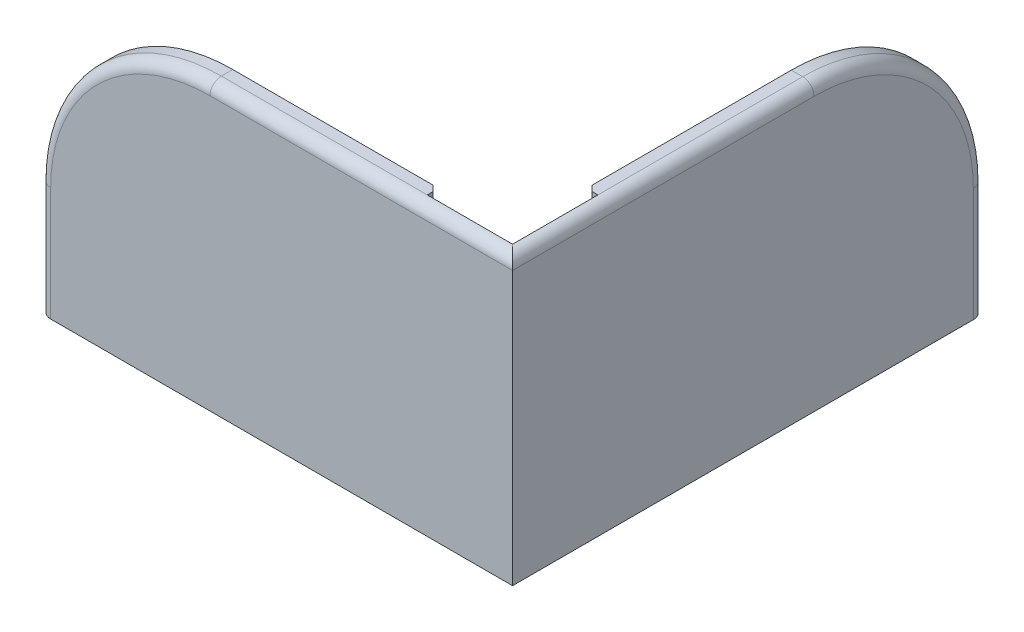
ISO-10303-21;
HEADER;
FILE_DESCRIPTION(('STEP AP214'),'2;1');
FILE_NAME('part.step','',(''),(''),'','','');
FILE_SCHEMA(('AUTOMOTIVE_DESIGN { 1 0 10303 214 1 1 1 1 }'));
ENDSEC;
DATA;
#1=APPLICATION_CONTEXT('core data for automotive mechanical design processes');
#2=APPLICATION_PROTOCOL_DEFINITION('international standard','automotive_design',2000,#1);
#3=PRODUCT_CONTEXT('',#1,'mechanical');
#4=PRODUCT('Part','Part','',(#3));
#5=PRODUCT_RELATED_PRODUCT_CATEGORY('part','',(#4));
#6=PRODUCT_DEFINITION_FORMATION('','',#4);
#7=PRODUCT_DEFINITION_CONTEXT('part definition',#1,'design');
#8=PRODUCT_DEFINITION('design','',#6,#7);
#9=PRODUCT_DEFINITION_SHAPE('','',#8);
#10=(LENGTH_UNIT() NAMED_UNIT(*) SI_UNIT(.MILLI.,.METRE.));
#11=(NAMED_UNIT(*) PLANE_ANGLE_UNIT() SI_UNIT($,.RADIAN.));
#12=(NAMED_UNIT(*) SI_UNIT($,.STERADIAN.) SOLID_ANGLE_UNIT());
#13=UNCERTAINTY_MEASURE_WITH_UNIT(LENGTH_MEASURE(1.E-05),#10,'distance_accuracy_value','');
#14=(GEOMETRIC_REPRESENTATION_CONTEXT(3) GLOBAL_UNCERTAINTY_ASSIGNED_CONTEXT((#13)) GLOBAL_UNIT_ASSIGNED_CONTEXT((#10,
#11,#12)) REPRESENTATION_CONTEXT('',''));
#15=CARTESIAN_POINT('',(0.,0.,0.));
#16=DIRECTION('',(0.,0.,1.));
#17=DIRECTION('',(1.,0.,0.));
#18=AXIS2_PLACEMENT_3D('',#15,#16,#17);
#19=CARTESIAN_POINT('',(0.,63.5,-1.27));
#20=DIRECTION('',(0.,1.,0.));
#21=DIRECTION('',(-1.,0.,0.));
#22=AXIS2_PLACEMENT_3D('',#19,#20,#21);
#23=PLANE('',#22);
#24=DIRECTION('',(0.,0.,1.));
#25=VECTOR('',#24,1.);
#26=CARTESIAN_POINT('',(-17.526,63.5,-1.27));
#27=LINE('',#26,#25);
#28=CARTESIAN_POINT('',(-17.526,63.5,0.));
#29=VERTEX_POINT('',#28);
#30=CARTESIAN_POINT('',(-17.526,63.5,1.27));
#31=VERTEX_POINT('',#30);
#32=EDGE_CURVE('E238',#29,#31,#27,.T.);
#33=ORIENTED_EDGE('',*,*,#32,.F.);
#34=DIRECTION('',(-0.707106781186551,0.,-0.707106781186544));
#35=VECTOR('',#34,1.);
#36=CARTESIAN_POINT('',(-9.3979999999999,63.5,8.12799999999999));
#37=LINE('',#36,#35);
#38=CARTESIAN_POINT('',(-18.796,63.5,-1.27));
#39=VERTEX_POINT('',#38);
#40=EDGE_CURVE('E378',#29,#39,#37,.T.);
#41=ORIENTED_EDGE('',*,*,#40,.T.);
#42=DIRECTION('',(-1.,0.,0.));
#43=VECTOR('',#42,1.);
#44=CARTESIAN_POINT('',(0.,63.5,-1.27));
#45=LINE('',#44,#43);
#46=CARTESIAN_POINT('',(-63.5,63.5,-1.27));
#47=VERTEX_POINT('',#46);
#48=EDGE_CURVE('E328',#39,#47,#45,.T.);
#49=ORIENTED_EDGE('',*,*,#48,.T.);
#50=DIRECTION('',(0.,0.,1.));
#51=VECTOR('',#50,1.);
#52=CARTESIAN_POINT('',(-63.5,63.5,-1.27));
#53=LINE('',#52,#51);
#54=CARTESIAN_POINT('',(-63.5,63.5,1.27));
#55=VERTEX_POINT('',#54);
#56=EDGE_CURVE('E298',#47,#55,#53,.T.);
#57=ORIENTED_EDGE('',*,*,#56,.T.);
#58=DIRECTION('',(-1.,0.,0.));
#59=VECTOR('',#58,1.);
#60=CARTESIAN_POINT('',(0.,63.5,1.27));
#61=LINE('',#60,#59);
#62=EDGE_CURVE('E244',#55,#31,#61,.F.);
#63=ORIENTED_EDGE('',*,*,#62,.T.);
#64=EDGE_LOOP('',(#33,#41,#49,#57,#63));
#65=FACE_BOUND('',#64,.T.);
#66=ADVANCED_FACE('F35',(#65),#23,.T.);
#67=CARTESIAN_POINT('',(0.253999999999998,25.4,-63.5));
#68=DIRECTION('',(-1.,0.,0.));
#69=DIRECTION('',(0.,0.,1.));
#70=AXIS2_PLACEMENT_3D('',#67,#68,#69);
#71=PLANE('',#70);
#72=DIRECTION('',(0.,1.,0.));
#73=VECTOR('',#72,1.);
#74=CARTESIAN_POINT('',(0.253999999999998,0.,0.));
#75=LINE('',#74,#73);
#76=CARTESIAN_POINT('',(0.253999999999998,0.,0.));
#77=VERTEX_POINT('',#76);
#78=CARTESIAN_POINT('',(0.253999999999998,11.43,0.));
#79=VERTEX_POINT('',#78);
#80=EDGE_CURVE('E212',#77,#79,#75,.T.);
#81=ORIENTED_EDGE('',*,*,#80,.T.);
#82=DIRECTION('',(0.,0.,-1.));
#83=VECTOR('',#82,1.);
#84=CARTESIAN_POINT('',(0.253999999999998,11.43,-17.78));
#85=LINE('',#84,#83);
#86=CARTESIAN_POINT('',(0.253999999999998,11.43,-17.78));
#87=VERTEX_POINT('',#86);
#88=EDGE_CURVE('E267',#79,#87,#85,.T.);
#89=ORIENTED_EDGE('',*,*,#88,.T.);
#90=DIRECTION('',(0.,1.,0.));
#91=VECTOR('',#90,1.);
#92=CARTESIAN_POINT('',(0.253999999999998,12.7,-17.78));
#93=LINE('',#92,#91);
#94=CARTESIAN_POINT('',(0.253999999999998,25.4,-17.78));
#95=VERTEX_POINT('',#94);
#96=EDGE_CURVE('E200',#87,#95,#93,.T.);
#97=ORIENTED_EDGE('',*,*,#96,.T.);
#98=DIRECTION('',(0.,0.,1.));
#99=VECTOR('',#98,1.);
#100=CARTESIAN_POINT('',(0.253999999999998,25.4,-17.78));
#101=LINE('',#100,#99);
#102=CARTESIAN_POINT('',(0.253999999999998,25.4,-101.6));
#103=VERTEX_POINT('',#102);
#104=EDGE_CURVE('E182',#103,#95,#101,.T.);
#105=ORIENTED_EDGE('',*,*,#104,.F.);
#106=DIRECTION('',(0.,-1.,0.));
#107=VECTOR('',#106,1.);
#108=CARTESIAN_POINT('',(0.253999999999998,0.,-101.6));
#109=LINE('',#108,#107);
#110=CARTESIAN_POINT('',(0.253999999999998,0.,-101.6));
#111=VERTEX_POINT('',#110);
#112=EDGE_CURVE('E207',#103,#111,#109,.T.);
#113=ORIENTED_EDGE('',*,*,#112,.T.);
#114=DIRECTION('',(0.,0.,1.));
#115=VECTOR('',#114,1.);
#116=CARTESIAN_POINT('',(0.253999999999998,0.,0.));
#117=LINE('',#116,#115);
#118=EDGE_CURVE('E210',#111,#77,#117,.T.);
#119=ORIENTED_EDGE('',*,*,#118,.T.);
#120=EDGE_LOOP('',(#81,#89,#97,#105,#113,#119));
#121=FACE_BOUND('',#120,.T.);
#122=ADVANCED_FACE('F398',(#121),#71,.T.);
#123=CARTESIAN_POINT('',(1.524,25.4,-63.5));
#124=DIRECTION('',(1.,0.,0.));
#125=DIRECTION('',(0.,0.,-1.));
#126=AXIS2_PLACEMENT_3D('',#123,#124,#125);
#127=PLANE('',#126);
#128=DIRECTION('',(0.,1.,0.));
#129=VECTOR('',#128,1.);
#130=CARTESIAN_POINT('',(1.524,12.7,-17.78));
#131=LINE('',#130,#129);
#132=CARTESIAN_POINT('',(1.524,12.7,-17.78));
#133=VERTEX_POINT('',#132);
#134=CARTESIAN_POINT('',(1.524,63.5,-17.78));
#135=VERTEX_POINT('',#134);
#136=EDGE_CURVE('E197',#133,#135,#131,.T.);
#137=ORIENTED_EDGE('',*,*,#136,.F.);
#138=DIRECTION('',(0.,0.,-1.));
#139=VECTOR('',#138,1.);
#140=CARTESIAN_POINT('',(1.524,12.7,1.27));
#141=LINE('',#140,#139);
#142=CARTESIAN_POINT('',(1.524,12.7,1.27));
#143=VERTEX_POINT('',#142);
#144=EDGE_CURVE('E306',#143,#133,#141,.T.);
#145=ORIENTED_EDGE('',*,*,#144,.F.);
#146=DIRECTION('',(0.,1.,0.));
#147=VECTOR('',#146,1.);
#148=CARTESIAN_POINT('',(1.524,0.,1.27));
#149=LINE('',#148,#147);
#150=CARTESIAN_POINT('',(1.524,63.5,1.27));
#151=VERTEX_POINT('',#150);
#152=EDGE_CURVE('E601',#143,#151,#149,.T.);
#153=ORIENTED_EDGE('',*,*,#152,.T.);
#154=DIRECTION('',(0.,0.,1.));
#155=VECTOR('',#154,1.);
#156=CARTESIAN_POINT('',(1.524,63.5,3.81));
#157=LINE('',#156,#155);
#158=EDGE_CURVE('E217',#135,#151,#157,.T.);
#159=ORIENTED_EDGE('',*,*,#158,.F.);
#160=EDGE_LOOP('',(#137,#145,#153,#159));
#161=FACE_BOUND('',#160,.T.);
#162=ADVANCED_FACE('F403',(#161),#127,.F.);
#163=DIRECTION('',(0.,0.,-1.));
#164=VECTOR('',#163,1.);
#165=CARTESIAN_POINT('',(-1.016,63.5,-17.78));
#166=LINE('',#165,#164);
#167=CARTESIAN_POINT('',(-1.016,63.5,-19.05));
#168=VERTEX_POINT('',#167);
#169=CARTESIAN_POINT('',(-1.016,63.5,-63.5));
#170=VERTEX_POINT('',#169);
#171=EDGE_CURVE('E175',#168,#170,#166,.T.);
#172=ORIENTED_EDGE('',*,*,#171,.F.);
#173=DIRECTION('',(0.707106781186543,0.,0.707106781186552));
#174=VECTOR('',#173,1.);
#175=CARTESIAN_POINT('',(8.38199999999999,63.5,-9.6519999999999));
#176=LINE('',#175,#174);
#177=CARTESIAN_POINT('',(0.253999999999991,63.5,-17.78));
#178=VERTEX_POINT('',#177);
#179=EDGE_CURVE('E52',#168,#178,#176,.T.);
#180=ORIENTED_EDGE('',*,*,#179,.T.);
#181=DIRECTION('',(1.,0.,0.));
#182=VECTOR('',#181,1.);
#183=CARTESIAN_POINT('',(0.253999999999998,63.5,-17.78));
#184=LINE('',#183,#182);
#185=EDGE_CURVE('E214',#178,#135,#184,.T.);
#186=ORIENTED_EDGE('',*,*,#185,.T.);
#187=DIRECTION('',(0.,0.,1.));
#188=VECTOR('',#187,1.);
#189=CARTESIAN_POINT('',(1.524,63.5,-1.27));
#190=LINE('',#189,#188);
#191=CARTESIAN_POINT('',(1.524,63.5,-63.5));
#192=VERTEX_POINT('',#191);
#193=EDGE_CURVE('E188',#135,#192,#190,.F.);
#194=ORIENTED_EDGE('',*,*,#193,.T.);
#195=DIRECTION('',(-1.,0.,0.));
#196=VECTOR('',#195,1.);
#197=CARTESIAN_POINT('',(4.064,63.5,-63.5));
#198=LINE('',#197,#196);
#199=EDGE_CURVE('E185',#192,#170,#198,.T.);
#200=ORIENTED_EDGE('',*,*,#199,.T.);
#201=EDGE_LOOP('',(#172,#180,#186,#194,#200));
#202=FACE_BOUND('',#201,.T.);
#203=ADVANCED_FACE('F186',(#202),#23,.T.);
#204=CARTESIAN_POINT('',(-17.526,0.,-1.27));
#205=DIRECTION('',(1.,0.,0.));
#206=DIRECTION('',(0.,0.,-1.));
#207=AXIS2_PLACEMENT_3D('',#204,#205,#206);
#208=PLANE('',#207);
#209=DIRECTION('',(0.,1.,0.));
#210=VECTOR('',#209,1.);
#211=CARTESIAN_POINT('',(-17.526,0.,0.));
#212=LINE('',#211,#210);
#213=CARTESIAN_POINT('',(-17.526,11.4299999999999,0.));
#214=VERTEX_POINT('',#213);
#215=CARTESIAN_POINT('',(-17.526,25.4,0.));
#216=VERTEX_POINT('',#215);
#217=EDGE_CURVE('E233',#214,#216,#212,.T.);
#218=ORIENTED_EDGE('',*,*,#217,.T.);
#219=DIRECTION('',(0.,1.,0.));
#220=VECTOR('',#219,1.);
#221=CARTESIAN_POINT('',(-17.526,63.5,0.));
#222=LINE('',#221,#220);
#223=EDGE_CURVE('E295',#216,#29,#222,.T.);
#224=ORIENTED_EDGE('',*,*,#223,.T.);
#225=ORIENTED_EDGE('',*,*,#32,.T.);
#226=DIRECTION('',(0.,1.,0.));
#227=VECTOR('',#226,1.);
#228=CARTESIAN_POINT('',(-17.526,0.,1.27));
#229=LINE('',#228,#227);
#230=CARTESIAN_POINT('',(-17.526,12.6999999999999,1.27));
#231=VERTEX_POINT('',#230);
#232=EDGE_CURVE('E303',#231,#31,#229,.T.);
#233=ORIENTED_EDGE('',*,*,#232,.F.);
#234=DIRECTION('',(0.,0.707106781186551,0.707106781186544));
#235=VECTOR('',#234,1.);
#236=CARTESIAN_POINT('',(-17.526,12.7,1.27000000000004));
#237=LINE('',#236,#235);
#238=EDGE_CURVE('E11',#231,#214,#237,.F.);
#239=ORIENTED_EDGE('',*,*,#238,.T.);
#240=EDGE_LOOP('',(#218,#224,#225,#233,#239));
#241=FACE_BOUND('',#240,.T.);
#242=ADVANCED_FACE('F383',(#241),#208,.T.);
#243=CARTESIAN_POINT('',(-63.5,25.4,-1.27));
#244=DIRECTION('',(0.,0.,1.));
#245=DIRECTION('',(1.,0.,0.));
#246=AXIS2_PLACEMENT_3D('',#243,#244,#245);
#247=CYLINDRICAL_SURFACE('',#246,38.1);
#248=CARTESIAN_POINT('',(-63.5,25.4,-1.27));
#249=DIRECTION('',(0.,0.,1.));
#250=DIRECTION('',(1.,0.,0.));
#251=AXIS2_PLACEMENT_3D('',#248,#249,#250);
#252=CIRCLE('',#251,38.1);
#253=CARTESIAN_POINT('',(-101.578827450435,26.67,-1.27));
#254=VERTEX_POINT('',#253);
#255=EDGE_CURVE('E345',#47,#254,#252,.T.);
#256=ORIENTED_EDGE('',*,*,#255,.T.);
#257=CARTESIAN_POINT('',(-63.5,25.4,0.));
#258=DIRECTION('',(0.,0.707106781186544,0.707106781186551));
#259=DIRECTION('',(0.,-0.707106781186551,0.707106781186544));
#260=AXIS2_PLACEMENT_3D('',#257,#258,#259);
#261=ELLIPSE('',#260,53.8815367264146,38.1);
#262=CARTESIAN_POINT('',(-101.6,25.4,0.));
#263=VERTEX_POINT('',#262);
#264=EDGE_CURVE('E293',#254,#263,#261,.T.);
#265=ORIENTED_EDGE('',*,*,#264,.T.);
#266=DIRECTION('',(0.,0.,-1.));
#267=VECTOR('',#266,1.);
#268=CARTESIAN_POINT('',(-101.6,25.4,1.27));
#269=LINE('',#268,#267);
#270=CARTESIAN_POINT('',(-101.6,25.4,1.27));
#271=VERTEX_POINT('',#270);
#272=EDGE_CURVE('E326',#271,#263,#269,.T.);
#273=ORIENTED_EDGE('',*,*,#272,.F.);
#274=CARTESIAN_POINT('',(-63.5,25.4,1.27));
#275=DIRECTION('',(0.,0.,1.));
#276=DIRECTION('',(1.,0.,0.));
#277=AXIS2_PLACEMENT_3D('',#274,#275,#276);
#278=CIRCLE('',#277,38.1);
#279=EDGE_CURVE('E263',#271,#55,#278,.F.);
#280=ORIENTED_EDGE('',*,*,#279,.T.);
#281=ORIENTED_EDGE('',*,*,#56,.F.);
#282=EDGE_LOOP('',(#256,#265,#273,#280,#281));
#283=FACE_BOUND('',#282,.T.);
#284=ADVANCED_FACE('F353',(#283),#247,.T.);
#285=CARTESIAN_POINT('',(0.,0.,-1.27));
#286=DIRECTION('',(0.,0.,1.));
#287=DIRECTION('',(1.,0.,0.));
#288=AXIS2_PLACEMENT_3D('',#285,#286,#287);
#289=PLANE('',#288);
#290=DIRECTION('',(0.,-1.,0.));
#291=VECTOR('',#290,1.);
#292=CARTESIAN_POINT('',(-18.796,25.4,-1.27));
#293=LINE('',#292,#291);
#294=CARTESIAN_POINT('',(-18.796,26.67,-1.27));
#295=VERTEX_POINT('',#294);
#296=EDGE_CURVE('E288',#39,#295,#293,.T.);
#297=ORIENTED_EDGE('',*,*,#296,.T.);
#298=DIRECTION('',(-1.,0.,0.));
#299=VECTOR('',#298,1.);
#300=CARTESIAN_POINT('',(0.,26.67,-1.27));
#301=LINE('',#300,#299);
#302=EDGE_CURVE('E290',#295,#254,#301,.T.);
#303=ORIENTED_EDGE('',*,*,#302,.T.);
#304=ORIENTED_EDGE('',*,*,#255,.F.);
#305=ORIENTED_EDGE('',*,*,#48,.F.);
#306=EDGE_LOOP('',(#297,#303,#304,#305));
#307=FACE_BOUND('',#306,.T.);
#308=ADVANCED_FACE('F356',(#307),#289,.F.);
#309=CARTESIAN_POINT('',(-101.6,0.,1.27));
#310=DIRECTION('',(1.,0.,0.));
#311=DIRECTION('',(0.,0.,-1.));
#312=AXIS2_PLACEMENT_3D('',#309,#310,#311);
#313=PLANE('',#312);
#314=DIRECTION('',(0.,0.,-1.));
#315=VECTOR('',#314,1.);
#316=CARTESIAN_POINT('',(-101.6,0.,1.27));
#317=LINE('',#316,#315);
#318=CARTESIAN_POINT('',(-101.6,0.,1.27));
#319=VERTEX_POINT('',#318);
#320=CARTESIAN_POINT('',(-101.6,0.,0.));
#321=VERTEX_POINT('',#320);
#322=EDGE_CURVE('E309',#319,#321,#317,.T.);
#323=ORIENTED_EDGE('',*,*,#322,.F.);
#324=DIRECTION('',(0.,-1.,0.));
#325=VECTOR('',#324,1.);
#326=CARTESIAN_POINT('',(-101.6,25.4,1.27));
#327=LINE('',#326,#325);
#328=EDGE_CURVE('E253',#319,#271,#327,.F.);
#329=ORIENTED_EDGE('',*,*,#328,.T.);
#330=ORIENTED_EDGE('',*,*,#272,.T.);
#331=DIRECTION('',(0.,-1.,0.));
#332=VECTOR('',#331,1.);
#333=CARTESIAN_POINT('',(-101.6,0.,0.));
#334=LINE('',#333,#332);
#335=EDGE_CURVE('E234',#263,#321,#334,.T.);
#336=ORIENTED_EDGE('',*,*,#335,.T.);
#337=EDGE_LOOP('',(#323,#329,#330,#336));
#338=FACE_BOUND('',#337,.T.);
#339=ADVANCED_FACE('F443',(#338),#313,.F.);
#340=CARTESIAN_POINT('',(0.,0.,1.27));
#341=DIRECTION('',(0.,-1.,0.));
#342=DIRECTION('',(1.,0.,0.));
#343=AXIS2_PLACEMENT_3D('',#340,#341,#342);
#344=PLANE('',#343);
#345=DIRECTION('',(1.,0.,0.));
#346=VECTOR('',#345,1.);
#347=CARTESIAN_POINT('',(0.,0.,3.81));
#348=LINE('',#347,#346);
#349=CARTESIAN_POINT('',(-99.06,0.,3.81));
#350=VERTEX_POINT('',#349);
#351=CARTESIAN_POINT('',(4.064,0.,3.81));
#352=VERTEX_POINT('',#351);
#353=EDGE_CURVE('E618',#350,#352,#348,.T.);
#354=ORIENTED_EDGE('',*,*,#353,.F.);
#355=CARTESIAN_POINT('',(-99.06,0.,1.27));
#356=DIRECTION('',(0.,-1.,0.));
#357=DIRECTION('',(1.,0.,0.));
#358=AXIS2_PLACEMENT_3D('',#355,#356,#357);
#359=CIRCLE('',#358,2.54);
#360=EDGE_CURVE('E251',#350,#319,#359,.T.);
#361=ORIENTED_EDGE('',*,*,#360,.T.);
#362=ORIENTED_EDGE('',*,*,#322,.T.);
#363=DIRECTION('',(-1.,0.,0.));
#364=VECTOR('',#363,1.);
#365=CARTESIAN_POINT('',(0.,0.,0.));
#366=LINE('',#365,#364);
#367=EDGE_CURVE('E230',#77,#321,#366,.T.);
#368=ORIENTED_EDGE('',*,*,#367,.F.);
#369=ORIENTED_EDGE('',*,*,#118,.F.);
#370=DIRECTION('',(-1.,0.,0.));
#371=VECTOR('',#370,1.);
#372=CARTESIAN_POINT('',(4.064,0.,-101.6));
#373=LINE('',#372,#371);
#374=CARTESIAN_POINT('',(1.524,0.,-101.6));
#375=VERTEX_POINT('',#374);
#376=EDGE_CURVE('E610',#375,#111,#373,.T.);
#377=ORIENTED_EDGE('',*,*,#376,.F.);
#378=CARTESIAN_POINT('',(1.524,0.,-99.06));
#379=DIRECTION('',(0.,-1.,0.));
#380=DIRECTION('',(1.,0.,0.));
#381=AXIS2_PLACEMENT_3D('',#378,#379,#380);
#382=CIRCLE('',#381,2.54);
#383=CARTESIAN_POINT('',(4.064,0.,-99.06));
#384=VERTEX_POINT('',#383);
#385=EDGE_CURVE('E247',#375,#384,#382,.T.);
#386=ORIENTED_EDGE('',*,*,#385,.T.);
#387=DIRECTION('',(0.,0.,-1.));
#388=VECTOR('',#387,1.);
#389=CARTESIAN_POINT('',(4.064,0.,0.));
#390=LINE('',#389,#388);
#391=EDGE_CURVE('E218',#352,#384,#390,.T.);
#392=ORIENTED_EDGE('',*,*,#391,.F.);
#393=EDGE_LOOP('',(#354,#361,#362,#368,#369,#377,#386,#392));
#394=FACE_BOUND('',#393,.T.);
#395=ADVANCED_FACE('F439',(#394),#344,.T.);
#396=CARTESIAN_POINT('',(0.,0.,0.));
#397=DIRECTION('',(0.,0.,1.));
#398=DIRECTION('',(1.,0.,0.));
#399=AXIS2_PLACEMENT_3D('',#396,#397,#398);
#400=PLANE('',#399);
#401=ORIENTED_EDGE('',*,*,#217,.F.);
#402=DIRECTION('',(1.,0.,0.));
#403=VECTOR('',#402,1.);
#404=CARTESIAN_POINT('',(0.,11.43,0.));
#405=LINE('',#404,#403);
#406=EDGE_CURVE('E286',#214,#79,#405,.T.);
#407=ORIENTED_EDGE('',*,*,#406,.T.);
#408=ORIENTED_EDGE('',*,*,#80,.F.);
#409=ORIENTED_EDGE('',*,*,#367,.T.);
#410=ORIENTED_EDGE('',*,*,#335,.F.);
#411=DIRECTION('',(-1.,0.,0.));
#412=VECTOR('',#411,1.);
#413=CARTESIAN_POINT('',(0.,25.4,0.));
#414=LINE('',#413,#412);
#415=EDGE_CURVE('E336',#216,#263,#414,.T.);
#416=ORIENTED_EDGE('',*,*,#415,.F.);
#417=EDGE_LOOP('',(#401,#407,#408,#409,#410,#416));
#418=FACE_BOUND('',#417,.T.);
#419=ADVANCED_FACE('F436',(#418),#400,.F.);
#420=CARTESIAN_POINT('',(0.,0.,1.27));
#421=DIRECTION('',(0.,0.,1.));
#422=DIRECTION('',(1.,0.,0.));
#423=AXIS2_PLACEMENT_3D('',#420,#421,#422);
#424=PLANE('',#423);
#425=ORIENTED_EDGE('',*,*,#152,.F.);
#426=DIRECTION('',(-1.,0.,0.));
#427=VECTOR('',#426,1.);
#428=CARTESIAN_POINT('',(0.,12.7,1.27));
#429=LINE('',#428,#427);
#430=EDGE_CURVE('E312',#143,#231,#429,.T.);
#431=ORIENTED_EDGE('',*,*,#430,.T.);
#432=ORIENTED_EDGE('',*,*,#232,.T.);
#433=DIRECTION('',(-1.,0.,0.));
#434=VECTOR('',#433,1.);
#435=CARTESIAN_POINT('',(0.,63.5,1.27));
#436=LINE('',#435,#434);
#437=EDGE_CURVE('E621',#151,#31,#436,.T.);
#438=ORIENTED_EDGE('',*,*,#437,.F.);
#439=EDGE_LOOP('',(#425,#431,#432,#438));
#440=FACE_BOUND('',#439,.T.);
#441=ADVANCED_FACE('F432',(#440),#424,.F.);
#442=CARTESIAN_POINT('',(0.,0.,3.81));
#443=DIRECTION('',(0.,0.,1.));
#444=DIRECTION('',(1.,0.,0.));
#445=AXIS2_PLACEMENT_3D('',#442,#443,#444);
#446=PLANE('',#445);
#447=DIRECTION('',(0.,-1.,0.));
#448=VECTOR('',#447,1.);
#449=CARTESIAN_POINT('',(4.064,0.,3.81));
#450=LINE('',#449,#448);
#451=CARTESIAN_POINT('',(4.064,60.96,3.81));
#452=VERTEX_POINT('',#451);
#453=EDGE_CURVE('E192',#452,#352,#450,.T.);
#454=ORIENTED_EDGE('',*,*,#453,.F.);
#455=DIRECTION('',(-1.,0.,0.));
#456=VECTOR('',#455,1.);
#457=CARTESIAN_POINT('',(0.,60.96,3.81));
#458=LINE('',#457,#456);
#459=CARTESIAN_POINT('',(-63.5,60.96,3.81));
#460=VERTEX_POINT('',#459);
#461=EDGE_CURVE('E240',#452,#460,#458,.T.);
#462=ORIENTED_EDGE('',*,*,#461,.T.);
#463=CARTESIAN_POINT('',(-63.5,25.4,3.81));
#464=DIRECTION('',(0.,0.,1.));
#465=DIRECTION('',(1.,0.,0.));
#466=AXIS2_PLACEMENT_3D('',#463,#464,#465);
#467=CIRCLE('',#466,35.56);
#468=CARTESIAN_POINT('',(-99.06,25.4,3.81));
#469=VERTEX_POINT('',#468);
#470=EDGE_CURVE('E235',#460,#469,#467,.T.);
#471=ORIENTED_EDGE('',*,*,#470,.T.);
#472=DIRECTION('',(0.,-1.,0.));
#473=VECTOR('',#472,1.);
#474=CARTESIAN_POINT('',(-99.06,0.,3.81));
#475=LINE('',#474,#473);
#476=EDGE_CURVE('E237',#469,#350,#475,.T.);
#477=ORIENTED_EDGE('',*,*,#476,.T.);
#478=ORIENTED_EDGE('',*,*,#353,.T.);
#479=EDGE_LOOP('',(#454,#462,#471,#477,#478));
#480=FACE_BOUND('',#479,.T.);
#481=ADVANCED_FACE('F428',(#480),#446,.T.);
#482=CARTESIAN_POINT('',(4.064,0.,-101.6));
#483=DIRECTION('',(0.,0.,1.));
#484=DIRECTION('',(1.,0.,0.));
#485=AXIS2_PLACEMENT_3D('',#482,#483,#484);
#486=PLANE('',#485);
#487=DIRECTION('',(-1.,0.,0.));
#488=VECTOR('',#487,1.);
#489=CARTESIAN_POINT('',(4.064,25.4,-101.6));
#490=LINE('',#489,#488);
#491=CARTESIAN_POINT('',(1.524,25.4,-101.6));
#492=VERTEX_POINT('',#491);
#493=EDGE_CURVE('E191',#492,#103,#490,.T.);
#494=ORIENTED_EDGE('',*,*,#493,.F.);
#495=DIRECTION('',(0.,1.,0.));
#496=VECTOR('',#495,1.);
#497=CARTESIAN_POINT('',(1.524,0.,-101.6));
#498=LINE('',#497,#496);
#499=EDGE_CURVE('E261',#492,#375,#498,.F.);
#500=ORIENTED_EDGE('',*,*,#499,.T.);
#501=ORIENTED_EDGE('',*,*,#376,.T.);
#502=ORIENTED_EDGE('',*,*,#112,.F.);
#503=EDGE_LOOP('',(#494,#500,#501,#502));
#504=FACE_BOUND('',#503,.T.);
#505=ADVANCED_FACE('F425',(#504),#486,.F.);
#506=CARTESIAN_POINT('',(4.064,25.4,-63.5));
#507=DIRECTION('',(-1.,0.,0.));
#508=DIRECTION('',(0.,0.,1.));
#509=AXIS2_PLACEMENT_3D('',#506,#507,#508);
#510=CYLINDRICAL_SURFACE('',#509,38.1);
#511=ORIENTED_EDGE('',*,*,#493,.T.);
#512=CARTESIAN_POINT('',(0.253999999999995,25.4,-63.5));
#513=DIRECTION('',(-0.707106781186552,-0.707106781186543,0.));
#514=DIRECTION('',(-0.707106781186543,0.707106781186552,0.));
#515=AXIS2_PLACEMENT_3D('',#512,#513,#514);
#516=ELLIPSE('',#515,53.8815367264146,38.1);
#517=CARTESIAN_POINT('',(-1.016,26.67,-101.578827450435));
#518=VERTEX_POINT('',#517);
#519=EDGE_CURVE('E196',#103,#518,#516,.F.);
#520=ORIENTED_EDGE('',*,*,#519,.T.);
#521=CARTESIAN_POINT('',(-1.016,25.4,-63.5));
#522=DIRECTION('',(-1.,0.,0.));
#523=DIRECTION('',(0.,0.,1.));
#524=AXIS2_PLACEMENT_3D('',#521,#522,#523);
#525=CIRCLE('',#524,38.1);
#526=EDGE_CURVE('E180',#170,#518,#525,.T.);
#527=ORIENTED_EDGE('',*,*,#526,.F.);
#528=ORIENTED_EDGE('',*,*,#199,.F.);
#529=CARTESIAN_POINT('',(1.524,25.4,-63.5));
#530=DIRECTION('',(1.,0.,0.));
#531=DIRECTION('',(0.,0.,-1.));
#532=AXIS2_PLACEMENT_3D('',#529,#530,#531);
#533=CIRCLE('',#532,38.1);
#534=EDGE_CURVE('E265',#192,#492,#533,.F.);
#535=ORIENTED_EDGE('',*,*,#534,.T.);
#536=EDGE_LOOP('',(#511,#520,#527,#528,#535));
#537=FACE_BOUND('',#536,.T.);
#538=ADVANCED_FACE('F194',(#537),#510,.T.);
#539=CARTESIAN_POINT('',(4.064,25.4,-63.5));
#540=DIRECTION('',(1.,0.,0.));
#541=DIRECTION('',(0.,0.,-1.));
#542=AXIS2_PLACEMENT_3D('',#539,#540,#541);
#543=PLANE('',#542);
#544=ORIENTED_EDGE('',*,*,#391,.T.);
#545=DIRECTION('',(0.,1.,0.));
#546=VECTOR('',#545,1.);
#547=CARTESIAN_POINT('',(4.064,25.4,-99.06));
#548=LINE('',#547,#546);
#549=CARTESIAN_POINT('',(4.064,25.4,-99.06));
#550=VERTEX_POINT('',#549);
#551=EDGE_CURVE('E259',#384,#550,#548,.T.);
#552=ORIENTED_EDGE('',*,*,#551,.T.);
#553=CARTESIAN_POINT('',(4.064,25.4,-63.5));
#554=DIRECTION('',(1.,0.,0.));
#555=DIRECTION('',(0.,0.,-1.));
#556=AXIS2_PLACEMENT_3D('',#553,#554,#555);
#557=CIRCLE('',#556,35.56);
#558=CARTESIAN_POINT('',(4.064,60.96,-63.5));
#559=VERTEX_POINT('',#558);
#560=EDGE_CURVE('E255',#550,#559,#557,.T.);
#561=ORIENTED_EDGE('',*,*,#560,.T.);
#562=DIRECTION('',(0.,0.,1.));
#563=VECTOR('',#562,1.);
#564=CARTESIAN_POINT('',(4.064,60.96,-63.5));
#565=LINE('',#564,#563);
#566=EDGE_CURVE('E257',#559,#452,#565,.T.);
#567=ORIENTED_EDGE('',*,*,#566,.T.);
#568=ORIENTED_EDGE('',*,*,#453,.T.);
#569=EDGE_LOOP('',(#544,#552,#561,#567,#568));
#570=FACE_BOUND('',#569,.T.);
#571=ADVANCED_FACE('F421',(#570),#543,.T.);
#572=CARTESIAN_POINT('',(0.253999999999998,12.7,-17.78));
#573=DIRECTION('',(0.,0.,-1.));
#574=DIRECTION('',(0.,1.,0.));
#575=AXIS2_PLACEMENT_3D('',#572,#573,#574);
#576=PLANE('',#575);
#577=ORIENTED_EDGE('',*,*,#185,.F.);
#578=DIRECTION('',(0.,-1.,0.));
#579=VECTOR('',#578,1.);
#580=CARTESIAN_POINT('',(0.253999999999991,25.4,-17.78));
#581=LINE('',#580,#579);
#582=EDGE_CURVE('E371',#178,#95,#581,.T.);
#583=ORIENTED_EDGE('',*,*,#582,.T.);
#584=ORIENTED_EDGE('',*,*,#96,.F.);
#585=DIRECTION('',(0.707106781186542,0.707106781186553,0.));
#586=VECTOR('',#585,1.);
#587=CARTESIAN_POINT('',(0.888999999999996,12.065,-17.78));
#588=LINE('',#587,#586);
#589=EDGE_CURVE('E44',#87,#133,#588,.T.);
#590=ORIENTED_EDGE('',*,*,#589,.T.);
#591=ORIENTED_EDGE('',*,*,#136,.T.);
#592=EDGE_LOOP('',(#577,#583,#584,#590,#591));
#593=FACE_BOUND('',#592,.T.);
#594=ADVANCED_FACE('F491',(#593),#576,.F.);
#595=CARTESIAN_POINT('',(-1.016,25.4,-63.5));
#596=DIRECTION('',(-1.,0.,0.));
#597=DIRECTION('',(0.,0.,1.));
#598=AXIS2_PLACEMENT_3D('',#595,#596,#597);
#599=PLANE('',#598);
#600=ORIENTED_EDGE('',*,*,#526,.T.);
#601=DIRECTION('',(0.,0.,1.));
#602=VECTOR('',#601,1.);
#603=CARTESIAN_POINT('',(-1.016,26.67,-17.78));
#604=LINE('',#603,#602);
#605=CARTESIAN_POINT('',(-1.016,26.67,-19.05));
#606=VERTEX_POINT('',#605);
#607=EDGE_CURVE('E375',#518,#606,#604,.T.);
#608=ORIENTED_EDGE('',*,*,#607,.T.);
#609=DIRECTION('',(0.,1.,0.));
#610=VECTOR('',#609,1.);
#611=CARTESIAN_POINT('',(-1.016,63.5,-19.05));
#612=LINE('',#611,#610);
#613=EDGE_CURVE('E181',#606,#168,#612,.T.);
#614=ORIENTED_EDGE('',*,*,#613,.T.);
#615=ORIENTED_EDGE('',*,*,#171,.T.);
#616=EDGE_LOOP('',(#600,#608,#614,#615));
#617=FACE_BOUND('',#616,.T.);
#618=ADVANCED_FACE('F177',(#617),#599,.T.);
#619=CARTESIAN_POINT('',(1.524,25.4,-99.06));
#620=DIRECTION('',(0.,-1.,0.));
#621=DIRECTION('',(0.,0.,-1.));
#622=AXIS2_PLACEMENT_3D('',#619,#620,#621);
#623=CYLINDRICAL_SURFACE('',#622,2.54);
#624=ORIENTED_EDGE('',*,*,#385,.F.);
#625=ORIENTED_EDGE('',*,*,#499,.F.);
#626=CARTESIAN_POINT('',(1.524,25.4,-99.06));
#627=DIRECTION('',(0.,1.,0.));
#628=DIRECTION('',(0.,0.,1.));
#629=AXIS2_PLACEMENT_3D('',#626,#627,#628);
#630=CIRCLE('',#629,2.54);
#631=EDGE_CURVE('E204',#550,#492,#630,.T.);
#632=ORIENTED_EDGE('',*,*,#631,.F.);
#633=ORIENTED_EDGE('',*,*,#551,.F.);
#634=EDGE_LOOP('',(#624,#625,#632,#633));
#635=FACE_BOUND('',#634,.T.);
#636=ADVANCED_FACE('F504',(#635),#623,.T.);
#637=CARTESIAN_POINT('',(1.524,25.4,-63.5));
#638=DIRECTION('',(1.,0.,0.));
#639=DIRECTION('',(0.,0.,-1.));
#640=AXIS2_PLACEMENT_3D('',#637,#638,#639);
#641=TOROIDAL_SURFACE('',#640,35.56,2.54);
#642=ORIENTED_EDGE('',*,*,#631,.T.);
#643=ORIENTED_EDGE('',*,*,#534,.F.);
#644=CARTESIAN_POINT('',(1.524,60.96,-63.5));
#645=DIRECTION('',(0.,0.,1.));
#646=DIRECTION('',(1.,0.,0.));
#647=AXIS2_PLACEMENT_3D('',#644,#645,#646);
#648=CIRCLE('',#647,2.54);
#649=EDGE_CURVE('E275',#559,#192,#648,.T.);
#650=ORIENTED_EDGE('',*,*,#649,.F.);
#651=ORIENTED_EDGE('',*,*,#560,.F.);
#652=EDGE_LOOP('',(#642,#643,#650,#651));
#653=FACE_BOUND('',#652,.T.);
#654=ADVANCED_FACE('F511',(#653),#641,.T.);
#655=CARTESIAN_POINT('',(-99.06,0.,1.27));
#656=DIRECTION('',(0.,1.,0.));
#657=DIRECTION('',(0.,0.,1.));
#658=AXIS2_PLACEMENT_3D('',#655,#656,#657);
#659=CYLINDRICAL_SURFACE('',#658,2.54);
#660=ORIENTED_EDGE('',*,*,#360,.F.);
#661=ORIENTED_EDGE('',*,*,#476,.F.);
#662=CARTESIAN_POINT('',(-99.06,25.4,1.27));
#663=DIRECTION('',(0.,1.,0.));
#664=DIRECTION('',(0.,0.,1.));
#665=AXIS2_PLACEMENT_3D('',#662,#663,#664);
#666=CIRCLE('',#665,2.54);
#667=EDGE_CURVE('E272',#271,#469,#666,.T.);
#668=ORIENTED_EDGE('',*,*,#667,.F.);
#669=ORIENTED_EDGE('',*,*,#328,.F.);
#670=EDGE_LOOP('',(#660,#661,#668,#669));
#671=FACE_BOUND('',#670,.T.);
#672=ADVANCED_FACE('F519',(#671),#659,.T.);
#673=CARTESIAN_POINT('',(1.524,60.96,-63.5));
#674=DIRECTION('',(0.,0.,1.));
#675=DIRECTION('',(1.,0.,0.));
#676=AXIS2_PLACEMENT_3D('',#673,#674,#675);
#677=CYLINDRICAL_SURFACE('',#676,2.54);
#678=ORIENTED_EDGE('',*,*,#193,.F.);
#679=ORIENTED_EDGE('',*,*,#158,.T.);
#680=CARTESIAN_POINT('',(1.524,60.96,1.27));
#681=DIRECTION('',(-0.707106781186547,0.,0.707106781186547));
#682=DIRECTION('',(0.707106781186547,0.,0.707106781186547));
#683=AXIS2_PLACEMENT_3D('',#680,#681,#682);
#684=ELLIPSE('',#683,3.59210244842766,2.54);
#685=EDGE_CURVE('E270',#452,#151,#684,.T.);
#686=ORIENTED_EDGE('',*,*,#685,.F.);
#687=ORIENTED_EDGE('',*,*,#566,.F.);
#688=ORIENTED_EDGE('',*,*,#649,.T.);
#689=EDGE_LOOP('',(#678,#679,#686,#687,#688));
#690=FACE_BOUND('',#689,.T.);
#691=ADVANCED_FACE('F527',(#690),#677,.T.);
#692=CARTESIAN_POINT('',(-63.5,25.4,1.27));
#693=DIRECTION('',(0.,0.,1.));
#694=DIRECTION('',(1.,0.,0.));
#695=AXIS2_PLACEMENT_3D('',#692,#693,#694);
#696=TOROIDAL_SURFACE('',#695,35.56,2.54);
#697=ORIENTED_EDGE('',*,*,#667,.T.);
#698=ORIENTED_EDGE('',*,*,#470,.F.);
#699=CARTESIAN_POINT('',(-63.5,60.96,1.27));
#700=DIRECTION('',(1.,0.,0.));
#701=DIRECTION('',(0.,0.,-1.));
#702=AXIS2_PLACEMENT_3D('',#699,#700,#701);
#703=CIRCLE('',#702,2.54);
#704=EDGE_CURVE('E268',#55,#460,#703,.T.);
#705=ORIENTED_EDGE('',*,*,#704,.F.);
#706=ORIENTED_EDGE('',*,*,#279,.F.);
#707=EDGE_LOOP('',(#697,#698,#705,#706));
#708=FACE_BOUND('',#707,.T.);
#709=ADVANCED_FACE('F535',(#708),#696,.T.);
#710=CARTESIAN_POINT('',(0.,60.96,1.27));
#711=DIRECTION('',(-1.,0.,0.));
#712=DIRECTION('',(0.,-1.,0.));
#713=AXIS2_PLACEMENT_3D('',#710,#711,#712);
#714=CYLINDRICAL_SURFACE('',#713,2.54);
#715=ORIENTED_EDGE('',*,*,#437,.T.);
#716=ORIENTED_EDGE('',*,*,#62,.F.);
#717=ORIENTED_EDGE('',*,*,#704,.T.);
#718=ORIENTED_EDGE('',*,*,#461,.F.);
#719=ORIENTED_EDGE('',*,*,#685,.T.);
#720=EDGE_LOOP('',(#715,#716,#717,#718,#719));
#721=FACE_BOUND('',#720,.T.);
#722=ADVANCED_FACE('F543',(#721),#714,.T.);
#723=CARTESIAN_POINT('',(0.,12.7,1.26999999999999));
#724=DIRECTION('',(0.,-0.707106781186544,0.707106781186551));
#725=DIRECTION('',(-1.,0.,0.));
#726=AXIS2_PLACEMENT_3D('',#723,#724,#725);
#727=PLANE('',#726);
#728=ORIENTED_EDGE('',*,*,#238,.F.);
#729=ORIENTED_EDGE('',*,*,#430,.F.);
#730=DIRECTION('',(0.577350269189623,0.577350269189632,0.577350269189623));
#731=VECTOR('',#730,1.);
#732=CARTESIAN_POINT('',(-20.9126666666664,-9.73666666666678,-21.1666666666664));
#733=LINE('',#732,#731);
#734=EDGE_CURVE('E271',#79,#143,#733,.T.);
#735=ORIENTED_EDGE('',*,*,#734,.F.);
#736=ORIENTED_EDGE('',*,*,#406,.F.);
#737=EDGE_LOOP('',(#728,#729,#735,#736));
#738=FACE_BOUND('',#737,.T.);
#739=ADVANCED_FACE('F394',(#738),#727,.F.);
#740=CARTESIAN_POINT('',(0.253999999999998,11.43,-63.5));
#741=DIRECTION('',(-0.707106781186553,0.707106781186542,0.));
#742=DIRECTION('',(0.,0.,1.));
#743=AXIS2_PLACEMENT_3D('',#740,#741,#742);
#744=PLANE('',#743);
#745=ORIENTED_EDGE('',*,*,#734,.T.);
#746=ORIENTED_EDGE('',*,*,#144,.T.);
#747=ORIENTED_EDGE('',*,*,#589,.F.);
#748=ORIENTED_EDGE('',*,*,#88,.F.);
#749=EDGE_LOOP('',(#745,#746,#747,#748));
#750=FACE_BOUND('',#749,.T.);
#751=ADVANCED_FACE('F387',(#750),#744,.T.);
#752=CARTESIAN_POINT('',(-17.526,0.,0.));
#753=DIRECTION('',(0.707106781186544,0.,-0.707106781186551));
#754=DIRECTION('',(0.,-1.,0.));
#755=AXIS2_PLACEMENT_3D('',#752,#753,#754);
#756=PLANE('',#755);
#757=ORIENTED_EDGE('',*,*,#40,.F.);
#758=ORIENTED_EDGE('',*,*,#223,.F.);
#759=DIRECTION('',(0.577350269189628,-0.577350269189628,0.577350269189622));
#760=VECTOR('',#759,1.);
#761=CARTESIAN_POINT('',(-9.05933333333327,16.9333333333333,8.46666666666661));
#762=LINE('',#761,#760);
#763=EDGE_CURVE('E361',#295,#216,#762,.T.);
#764=ORIENTED_EDGE('',*,*,#763,.F.);
#765=ORIENTED_EDGE('',*,*,#296,.F.);
#766=EDGE_LOOP('',(#757,#758,#764,#765));
#767=FACE_BOUND('',#766,.T.);
#768=ADVANCED_FACE('F385',(#767),#756,.T.);
#769=CARTESIAN_POINT('',(0.,26.67,-1.27));
#770=DIRECTION('',(0.,0.707106781186544,0.707106781186551));
#771=DIRECTION('',(-1.,0.,0.));
#772=AXIS2_PLACEMENT_3D('',#769,#770,#771);
#773=PLANE('',#772);
#774=ORIENTED_EDGE('',*,*,#763,.T.);
#775=ORIENTED_EDGE('',*,*,#415,.T.);
#776=ORIENTED_EDGE('',*,*,#264,.F.);
#777=ORIENTED_EDGE('',*,*,#302,.F.);
#778=EDGE_LOOP('',(#774,#775,#776,#777));
#779=FACE_BOUND('',#778,.T.);
#780=ADVANCED_FACE('F360',(#779),#773,.F.);
#781=CARTESIAN_POINT('',(-1.016,25.4,-19.05));
#782=DIRECTION('',(-0.707106781186552,0.,0.707106781186543));
#783=DIRECTION('',(0.,-1.,0.));
#784=AXIS2_PLACEMENT_3D('',#781,#782,#783);
#785=PLANE('',#784);
#786=ORIENTED_EDGE('',*,*,#179,.F.);
#787=ORIENTED_EDGE('',*,*,#613,.F.);
#788=DIRECTION('',(0.577350269189621,-0.577350269189628,0.577350269189628));
#789=VECTOR('',#788,1.);
#790=CARTESIAN_POINT('',(-0.592666666666666,26.2466666666667,-18.6266666666667));
#791=LINE('',#790,#789);
#792=EDGE_CURVE('E39',#95,#606,#791,.F.);
#793=ORIENTED_EDGE('',*,*,#792,.F.);
#794=ORIENTED_EDGE('',*,*,#582,.F.);
#795=EDGE_LOOP('',(#786,#787,#793,#794));
#796=FACE_BOUND('',#795,.T.);
#797=ADVANCED_FACE('F37',(#796),#785,.T.);
#798=CARTESIAN_POINT('',(-1.016,26.67,-63.5));
#799=DIRECTION('',(-0.707106781186552,-0.707106781186543,0.));
#800=DIRECTION('',(0.,0.,-1.));
#801=AXIS2_PLACEMENT_3D('',#798,#799,#800);
#802=PLANE('',#801);
#803=ORIENTED_EDGE('',*,*,#519,.F.);
#804=ORIENTED_EDGE('',*,*,#104,.T.);
#805=ORIENTED_EDGE('',*,*,#792,.T.);
#806=ORIENTED_EDGE('',*,*,#607,.F.);
#807=EDGE_LOOP('',(#803,#804,#805,#806));
#808=FACE_BOUND('',#807,.T.);
#809=ADVANCED_FACE('F580',(#808),#802,.T.);
#810=CLOSED_SHELL('',(#66,#122,#162,#203,#242,#284,#308,#339,#395,#419,#441,#481,#505,#538,#571,
#594,#618,#636,#654,#672,#691,#709,#722,#739,#751,#768,#780,#797,#809));
#811=MANIFOLD_SOLID_BREP('B2',#810);
#812=ADVANCED_BREP_SHAPE_REPRESENTATION('',(#18,#811),#14);
#813=SHAPE_DEFINITION_REPRESENTATION(#9,#812);
ENDSEC;
END-ISO-10303-21;
